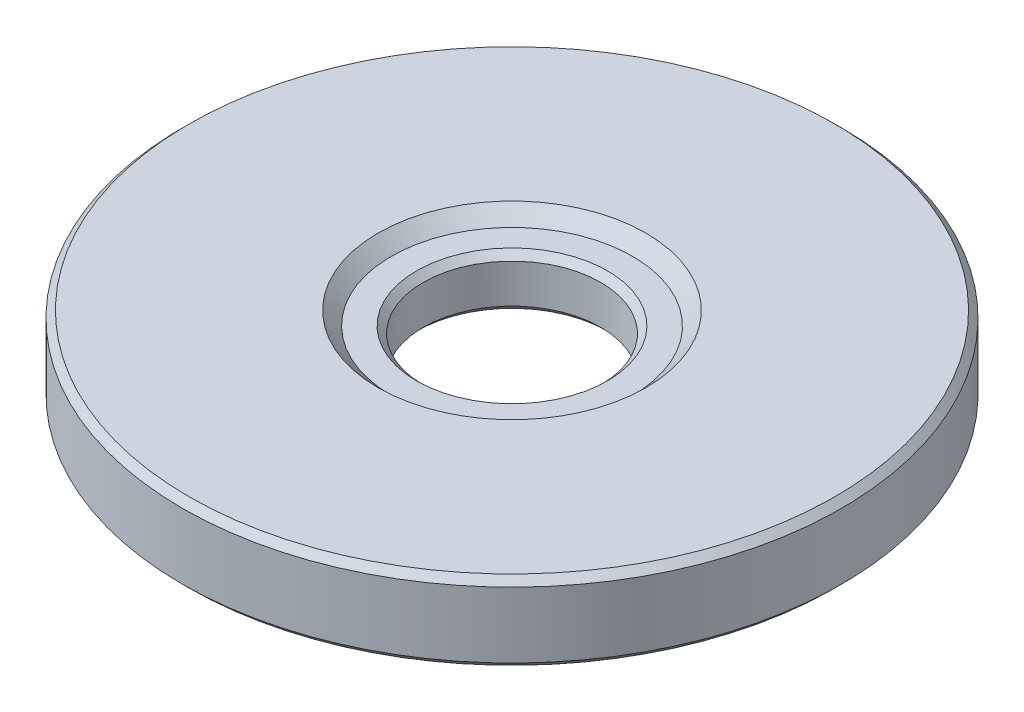
ISO-10303-21;
HEADER;
FILE_DESCRIPTION(('STEP AP214'),'2;1');
FILE_NAME('part.step','',(''),(''),'','','');
FILE_SCHEMA(('AUTOMOTIVE_DESIGN { 1 0 10303 214 1 1 1 1 }'));
ENDSEC;
DATA;
#1=APPLICATION_CONTEXT('core data for automotive mechanical design processes');
#2=APPLICATION_PROTOCOL_DEFINITION('international standard','automotive_design',2000,#1);
#3=PRODUCT_CONTEXT('',#1,'mechanical');
#4=PRODUCT('Part','Part','',(#3));
#5=PRODUCT_RELATED_PRODUCT_CATEGORY('part','',(#4));
#6=PRODUCT_DEFINITION_FORMATION('','',#4);
#7=PRODUCT_DEFINITION_CONTEXT('part definition',#1,'design');
#8=PRODUCT_DEFINITION('design','',#6,#7);
#9=PRODUCT_DEFINITION_SHAPE('','',#8);
#10=(LENGTH_UNIT() NAMED_UNIT(*) SI_UNIT(.MILLI.,.METRE.));
#11=(NAMED_UNIT(*) PLANE_ANGLE_UNIT() SI_UNIT($,.RADIAN.));
#12=(NAMED_UNIT(*) SI_UNIT($,.STERADIAN.) SOLID_ANGLE_UNIT());
#13=UNCERTAINTY_MEASURE_WITH_UNIT(LENGTH_MEASURE(1.E-05),#10,'distance_accuracy_value','');
#14=(GEOMETRIC_REPRESENTATION_CONTEXT(3) GLOBAL_UNCERTAINTY_ASSIGNED_CONTEXT((#13)) GLOBAL_UNIT_ASSIGNED_CONTEXT((#10,
#11,#12)) REPRESENTATION_CONTEXT('',''));
#15=CARTESIAN_POINT('',(0.,0.,0.));
#16=DIRECTION('',(0.,0.,1.));
#17=DIRECTION('',(1.,0.,0.));
#18=AXIS2_PLACEMENT_3D('',#15,#16,#17);
#19=CARTESIAN_POINT('',(43.4842650987548,27.1133773595333,-40.3474045988901));
#20=DIRECTION('',(0.,-1.,0.));
#21=DIRECTION('',(0.,0.,-1.));
#22=AXIS2_PLACEMENT_3D('',#19,#20,#21);
#23=CYLINDRICAL_SURFACE('',#22,12.5);
#24=CARTESIAN_POINT('',(43.4842650987548,24.3673773651333,-40.3474045988901));
#25=DIRECTION('',(0.,1.,0.));
#26=DIRECTION('',(0.,0.,1.));
#27=AXIS2_PLACEMENT_3D('',#24,#25,#26);
#28=CIRCLE('',#27,12.5);
#29=CARTESIAN_POINT('',(43.4842650987548,24.3673773651333,-27.8474045988901));
#30=VERTEX_POINT('',#29);
#31=EDGE_CURVE('E25',#30,#30,#28,.T.);
#32=ORIENTED_EDGE('',*,*,#31,.T.);
#33=EDGE_LOOP('',(#32));
#34=FACE_BOUND('',#33,.T.);
#35=CARTESIAN_POINT('',(43.4842650987548,26.8593773595333,-40.3474045988901));
#36=DIRECTION('',(0.,1.,0.));
#37=DIRECTION('',(0.,0.,1.));
#38=AXIS2_PLACEMENT_3D('',#35,#36,#37);
#39=CIRCLE('',#38,12.5);
#40=CARTESIAN_POINT('',(43.4842650987548,26.8593773595333,-27.8474045988901));
#41=VERTEX_POINT('',#40);
#42=EDGE_CURVE('E29',#41,#41,#39,.F.);
#43=ORIENTED_EDGE('',*,*,#42,.T.);
#44=EDGE_LOOP('',(#43));
#45=FACE_BOUND('',#44,.T.);
#46=ADVANCED_FACE('F14',(#34,#45),#23,.T.);
#47=CARTESIAN_POINT('',(43.4842650987548,27.1133773595333,-40.3474045988901));
#48=DIRECTION('',(0.,1.,0.));
#49=DIRECTION('',(0.,0.,1.));
#50=AXIS2_PLACEMENT_3D('',#47,#48,#49);
#51=PLANE('',#50);
#52=CARTESIAN_POINT('',(43.4842650987548,27.1133773595333,-40.3474045988901));
#53=DIRECTION('',(0.,1.,0.));
#54=DIRECTION('',(0.,0.,1.));
#55=AXIS2_PLACEMENT_3D('',#52,#53,#54);
#56=CIRCLE('',#55,12.246);
#57=CARTESIAN_POINT('',(43.4842650987548,27.1133773595333,-28.1014045988901));
#58=VERTEX_POINT('',#57);
#59=EDGE_CURVE('E9',#58,#58,#56,.T.);
#60=ORIENTED_EDGE('',*,*,#59,.T.);
#61=EDGE_LOOP('',(#60));
#62=FACE_BOUND('',#61,.T.);
#63=CARTESIAN_POINT('',(43.4842650987548,27.1133773595333,-40.3474045988901));
#64=DIRECTION('',(0.,1.,0.));
#65=DIRECTION('',(0.,0.,1.));
#66=AXIS2_PLACEMENT_3D('',#63,#64,#65);
#67=CIRCLE('',#66,5.08);
#68=CARTESIAN_POINT('',(43.4842650987548,27.1133773595333,-35.2674045988901));
#69=VERTEX_POINT('',#68);
#70=EDGE_CURVE('E55',#69,#69,#67,.T.);
#71=ORIENTED_EDGE('',*,*,#70,.F.);
#72=EDGE_LOOP('',(#71));
#73=FACE_BOUND('',#72,.T.);
#74=ADVANCED_FACE('F62',(#62,#73),#51,.T.);
#75=CARTESIAN_POINT('',(43.4842650987548,24.1133773651333,-40.3474045988901));
#76=DIRECTION('',(0.,1.,0.));
#77=DIRECTION('',(0.,0.,1.));
#78=AXIS2_PLACEMENT_3D('',#75,#76,#77);
#79=PLANE('',#78);
#80=CARTESIAN_POINT('',(43.4842650987548,24.1133773651333,-40.3474045988901));
#81=DIRECTION('',(0.,1.,0.));
#82=DIRECTION('',(0.,0.,1.));
#83=AXIS2_PLACEMENT_3D('',#80,#81,#82);
#84=CIRCLE('',#83,12.246);
#85=CARTESIAN_POINT('',(43.4842650987548,24.1133773651333,-28.1014045988901));
#86=VERTEX_POINT('',#85);
#87=EDGE_CURVE('E21',#86,#86,#84,.F.);
#88=ORIENTED_EDGE('',*,*,#87,.T.);
#89=EDGE_LOOP('',(#88));
#90=FACE_BOUND('',#89,.T.);
#91=CARTESIAN_POINT('',(43.4842650987548,24.1133773651333,-40.3474045988901));
#92=DIRECTION('',(0.,-1.,0.));
#93=DIRECTION('',(0.,0.,-1.));
#94=AXIS2_PLACEMENT_3D('',#91,#92,#93);
#95=CIRCLE('',#94,5.08);
#96=CARTESIAN_POINT('',(43.4842650987548,24.1133773651333,-45.4274045988901));
#97=VERTEX_POINT('',#96);
#98=EDGE_CURVE('E52',#97,#97,#95,.T.);
#99=ORIENTED_EDGE('',*,*,#98,.F.);
#100=EDGE_LOOP('',(#99));
#101=FACE_BOUND('',#100,.T.);
#102=ADVANCED_FACE('F64',(#90,#101),#79,.F.);
#103=CARTESIAN_POINT('',(43.4842650987548,24.6213773651333,-40.3474045988901));
#104=DIRECTION('',(0.,-1.,0.));
#105=DIRECTION('',(0.,0.,-1.));
#106=AXIS2_PLACEMENT_3D('',#103,#104,#105);
#107=PLANE('',#106);
#108=CARTESIAN_POINT('',(43.4842650987548,24.6213773651333,-40.3474045988901));
#109=DIRECTION('',(0.,-1.,0.));
#110=DIRECTION('',(0.,0.,-1.));
#111=AXIS2_PLACEMENT_3D('',#108,#109,#110);
#112=CIRCLE('',#111,3.61949999999999);
#113=CARTESIAN_POINT('',(43.4842650987548,24.6213773651333,-43.9669045988901));
#114=VERTEX_POINT('',#113);
#115=EDGE_CURVE('E34',#114,#114,#112,.F.);
#116=ORIENTED_EDGE('',*,*,#115,.T.);
#117=EDGE_LOOP('',(#116));
#118=FACE_BOUND('',#117,.T.);
#119=CARTESIAN_POINT('',(43.4842650987548,24.6213773651333,-40.3474045988901));
#120=DIRECTION('',(0.,-1.,0.));
#121=DIRECTION('',(0.,0.,-1.));
#122=AXIS2_PLACEMENT_3D('',#119,#120,#121);
#123=CIRCLE('',#122,4.572);
#124=CARTESIAN_POINT('',(43.4842650987548,24.6213773651333,-44.9194045988901));
#125=VERTEX_POINT('',#124);
#126=EDGE_CURVE('E46',#125,#125,#123,.T.);
#127=ORIENTED_EDGE('',*,*,#126,.T.);
#128=EDGE_LOOP('',(#127));
#129=FACE_BOUND('',#128,.T.);
#130=ADVANCED_FACE('F71',(#118,#129),#107,.T.);
#131=CARTESIAN_POINT('',(43.4842650987548,26.6053773595333,-40.3474045988901));
#132=DIRECTION('',(0.,1.,0.));
#133=DIRECTION('',(0.,0.,1.));
#134=AXIS2_PLACEMENT_3D('',#131,#132,#133);
#135=PLANE('',#134);
#136=CARTESIAN_POINT('',(43.4842650987548,26.6053773595333,-40.3474045988901));
#137=DIRECTION('',(0.,1.,0.));
#138=DIRECTION('',(0.,0.,1.));
#139=AXIS2_PLACEMENT_3D('',#136,#137,#138);
#140=CIRCLE('',#139,3.6195);
#141=CARTESIAN_POINT('',(43.4842650987548,26.6053773595333,-36.7279045988901));
#142=VERTEX_POINT('',#141);
#143=EDGE_CURVE('E37',#142,#142,#140,.F.);
#144=ORIENTED_EDGE('',*,*,#143,.T.);
#145=EDGE_LOOP('',(#144));
#146=FACE_BOUND('',#145,.T.);
#147=CARTESIAN_POINT('',(43.4842650987548,26.6053773595333,-40.3474045988901));
#148=DIRECTION('',(0.,1.,0.));
#149=DIRECTION('',(0.,0.,1.));
#150=AXIS2_PLACEMENT_3D('',#147,#148,#149);
#151=CIRCLE('',#150,4.572);
#152=CARTESIAN_POINT('',(43.4842650987548,26.6053773595333,-35.7754045988901));
#153=VERTEX_POINT('',#152);
#154=EDGE_CURVE('E49',#153,#153,#151,.T.);
#155=ORIENTED_EDGE('',*,*,#154,.T.);
#156=EDGE_LOOP('',(#155));
#157=FACE_BOUND('',#156,.T.);
#158=ADVANCED_FACE('F81',(#146,#157),#135,.T.);
#159=CARTESIAN_POINT('',(43.4842650987548,26.6053773595333,-40.3474045988901));
#160=DIRECTION('',(0.,1.,0.));
#161=DIRECTION('',(0.,0.,1.));
#162=AXIS2_PLACEMENT_3D('',#159,#160,#161);
#163=CONICAL_SURFACE('',#162,4.572,0.785398163397448);
#164=CARTESIAN_POINT('',(43.4842650987548,27.1133773595333,-35.2674045988901));
#165=CARTESIAN_POINT('',(43.4842650987548,27.1080856928666,-35.2726962655567));
#166=CARTESIAN_POINT('',(43.4842650987548,27.1027940261999,-35.2779879322234));
#167=CARTESIAN_POINT('',(43.4842650987548,27.0922106928666,-35.2885712655568));
#168=CARTESIAN_POINT('',(43.4842650987548,27.0869190261999,-35.2938629322234));
#169=CARTESIAN_POINT('',(43.4842650987548,27.0763356928666,-35.3044462655568));
#170=CARTESIAN_POINT('',(43.4842650987548,27.0710440261999,-35.3097379322234));
#171=CARTESIAN_POINT('',(43.4842650987548,27.0604606928666,-35.3203212655567));
#172=CARTESIAN_POINT('',(43.4842650987548,27.0551690261999,-35.3256129322234));
#173=CARTESIAN_POINT('',(43.4842650987548,27.0445856928666,-35.3361962655568));
#174=CARTESIAN_POINT('',(43.4842650987548,27.0392940261999,-35.3414879322234));
#175=CARTESIAN_POINT('',(43.4842650987548,27.0287106928666,-35.3520712655568));
#176=CARTESIAN_POINT('',(43.4842650987548,27.0234190261999,-35.3573629322234));
#177=CARTESIAN_POINT('',(43.4842650987548,27.0128356928666,-35.3679462655568));
#178=CARTESIAN_POINT('',(43.4842650987548,27.0075440261999,-35.3732379322234));
#179=CARTESIAN_POINT('',(43.4842650987548,26.9969606928666,-35.3838212655568));
#180=CARTESIAN_POINT('',(43.4842650987548,26.9916690261999,-35.3891129322234));
#181=CARTESIAN_POINT('',(43.4842650987548,26.9810856928666,-35.3996962655567));
#182=CARTESIAN_POINT('',(43.4842650987548,26.9757940261999,-35.4049879322234));
#183=CARTESIAN_POINT('',(43.4842650987548,26.9652106928666,-35.4155712655567));
#184=CARTESIAN_POINT('',(43.4842650987548,26.9599190261999,-35.4208629322234));
#185=CARTESIAN_POINT('',(43.4842650987548,26.9493356928666,-35.4314462655568));
#186=CARTESIAN_POINT('',(43.4842650987548,26.9440440261999,-35.4367379322234));
#187=CARTESIAN_POINT('',(43.4842650987548,26.9334606928666,-35.4473212655568));
#188=CARTESIAN_POINT('',(43.4842650987548,26.9281690261999,-35.4526129322234));
#189=CARTESIAN_POINT('',(43.4842650987548,26.9175856928666,-35.4631962655568));
#190=CARTESIAN_POINT('',(43.4842650987548,26.9122940261999,-35.4684879322234));
#191=CARTESIAN_POINT('',(43.4842650987548,26.9017106928666,-35.4790712655568));
#192=CARTESIAN_POINT('',(43.4842650987548,26.8964190261999,-35.4843629322234));
#193=CARTESIAN_POINT('',(43.4842650987548,26.8858356928666,-35.4949462655567));
#194=CARTESIAN_POINT('',(43.4842650987548,26.8805440261999,-35.5002379322234));
#195=CARTESIAN_POINT('',(43.4842650987548,26.8699606928666,-35.5108212655567));
#196=CARTESIAN_POINT('',(43.4842650987548,26.8646690261999,-35.5161129322234));
#197=CARTESIAN_POINT('',(43.4842650987548,26.8540856928666,-35.5266962655568));
#198=CARTESIAN_POINT('',(43.4842650987548,26.8487940261999,-35.5319879322234));
#199=CARTESIAN_POINT('',(43.4842650987548,26.8382106928666,-35.5425712655568));
#200=CARTESIAN_POINT('',(43.4842650987548,26.8329190261999,-35.5478629322234));
#201=CARTESIAN_POINT('',(43.4842650987548,26.8223356928666,-35.5584462655568));
#202=CARTESIAN_POINT('',(43.4842650987548,26.8170440261999,-35.5637379322234));
#203=CARTESIAN_POINT('',(43.4842650987548,26.8064606928666,-35.5743212655567));
#204=CARTESIAN_POINT('',(43.4842650987548,26.8011690261999,-35.5796129322234));
#205=CARTESIAN_POINT('',(43.4842650987548,26.7905856928666,-35.5901962655568));
#206=CARTESIAN_POINT('',(43.4842650987548,26.7852940261999,-35.5954879322234));
#207=CARTESIAN_POINT('',(43.4842650987548,26.7747106928666,-35.6060712655567));
#208=CARTESIAN_POINT('',(43.4842650987548,26.7694190261999,-35.6113629322234));
#209=CARTESIAN_POINT('',(43.4842650987548,26.7588356928666,-35.6219462655568));
#210=CARTESIAN_POINT('',(43.4842650987548,26.7535440261999,-35.6272379322234));
#211=CARTESIAN_POINT('',(43.4842650987548,26.7429606928666,-35.6378212655568));
#212=CARTESIAN_POINT('',(43.4842650987548,26.7376690261999,-35.6431129322234));
#213=CARTESIAN_POINT('',(43.4842650987548,26.7270856928666,-35.6536962655567));
#214=CARTESIAN_POINT('',(43.4842650987548,26.7217940261999,-35.6589879322234));
#215=CARTESIAN_POINT('',(43.4842650987548,26.7112106928666,-35.6695712655567));
#216=CARTESIAN_POINT('',(43.4842650987548,26.7059190261999,-35.6748629322234));
#217=CARTESIAN_POINT('',(43.4842650987548,26.6953356928666,-35.6854462655568));
#218=CARTESIAN_POINT('',(43.4842650987548,26.6900440261999,-35.6907379322234));
#219=CARTESIAN_POINT('',(43.4842650987548,26.6794606928666,-35.7013212655568));
#220=CARTESIAN_POINT('',(43.4842650987548,26.6741690261999,-35.7066129322234));
#221=CARTESIAN_POINT('',(43.4842650987548,26.6635856928666,-35.7171962655568));
#222=CARTESIAN_POINT('',(43.4842650987548,26.6582940261999,-35.7224879322234));
#223=CARTESIAN_POINT('',(43.4842650987548,26.6477106928666,-35.7330712655567));
#224=CARTESIAN_POINT('',(43.4842650987548,26.6424190261999,-35.7383629322234));
#225=CARTESIAN_POINT('',(43.4842650987548,26.6318356928666,-35.7489462655568));
#226=CARTESIAN_POINT('',(43.4842650987548,26.6265440261999,-35.7542379322234));
#227=CARTESIAN_POINT('',(43.4842650987548,26.6159606928666,-35.7648212655568));
#228=CARTESIAN_POINT('',(43.4842650987548,26.6106690261999,-35.7701129322234));
#229=CARTESIAN_POINT('',(43.4842650987548,26.6053773595333,-35.7754045988901));
#230=B_SPLINE_CURVE_WITH_KNOTS('',3,(#164,#165,#166,#167,#168,#169,#170,#171,#172,#173,#174,
#175,#176,#177,#178,#179,#180,#181,#182,#183,#184,#185,#186,#187,#188,#189,#190,#191,#192,#193,
#194,#195,#196,#197,#198,#199,#200,#201,#202,#203,#204,#205,#206,#207,#208,#209,#210,#211,#212,
#213,#214,#215,#216,#217,#218,#219,#220,#221,#222,#223,#224,#225,#226,#227,#228,#229),
.UNSPECIFIED.,.F.,.F.,(4,2,2,2,2,2,2,2,2,2,2,2,2,2,2,2,2,2,2,2,2,2,2,2,2,2,2,2,2,2,2,2,4),(0.,
0.0224506403026733,0.044901280605349,0.0673519209080222,0.089802561210693,0.112253201513364,
0.134703841816037,0.157154482118713,0.179605122421386,0.202055762724057,0.22450640302673,
0.246957043329406,0.269407683632077,0.29185832393475,0.314308964237421,0.336759604540094,
0.359210244842765,0.38166088514544,0.404111525448114,0.426562165750784,0.449012806053458,
0.471463446356133,0.493914086658804,0.516364726961478,0.538815367264148,0.561266007566822,
0.583716647869492,0.606167288172168,0.628617928474841,0.651068568777512,0.673519209080185,
0.695969849382861,0.718420489685532),.UNSPECIFIED.);
#231=EDGE_CURVE('BSEAM59',#69,#153,#230,.T.);
#232=ORIENTED_EDGE('',*,*,#70,.T.);
#233=ORIENTED_EDGE('',*,*,#154,.F.);
#234=ORIENTED_EDGE('',*,*,#231,.T.);
#235=ORIENTED_EDGE('',*,*,#231,.F.);
#236=EDGE_LOOP('',(#232,#234,#233,#235));
#237=FACE_BOUND('',#236,.T.);
#238=ADVANCED_FACE('F59',(#237),#163,.F.);
#239=CARTESIAN_POINT('',(43.4842650987548,24.6213773651333,-40.3474045988901));
#240=DIRECTION('',(0.,-1.,0.));
#241=DIRECTION('',(0.,0.,-1.));
#242=AXIS2_PLACEMENT_3D('',#239,#240,#241);
#243=CONICAL_SURFACE('',#242,4.572,0.785398163397446);
#244=ORIENTED_EDGE('',*,*,#98,.T.);
#245=EDGE_LOOP('',(#244));
#246=FACE_BOUND('',#245,.T.);
#247=ORIENTED_EDGE('',*,*,#126,.F.);
#248=EDGE_LOOP('',(#247));
#249=FACE_BOUND('',#248,.T.);
#250=ADVANCED_FACE('F80',(#246,#249),#243,.F.);
#251=CARTESIAN_POINT('',(43.4842650987548,27.1133773595333,-40.3474045988901));
#252=DIRECTION('',(0.,-1.,0.));
#253=DIRECTION('',(0.,0.,-1.));
#254=AXIS2_PLACEMENT_3D('',#251,#252,#253);
#255=CYLINDRICAL_SURFACE('',#254,3.3655);
#256=CARTESIAN_POINT('',(43.4842650987548,26.3513773595333,-40.3474045988901));
#257=DIRECTION('',(0.,1.,0.));
#258=DIRECTION('',(0.,0.,1.));
#259=AXIS2_PLACEMENT_3D('',#256,#257,#258);
#260=CIRCLE('',#259,3.3655);
#261=CARTESIAN_POINT('',(43.4842650987548,26.3513773595333,-36.9819045988901));
#262=VERTEX_POINT('',#261);
#263=EDGE_CURVE('E40',#262,#262,#260,.T.);
#264=ORIENTED_EDGE('',*,*,#263,.T.);
#265=EDGE_LOOP('',(#264));
#266=FACE_BOUND('',#265,.T.);
#267=CARTESIAN_POINT('',(43.4842650987548,24.8753773651333,-40.3474045988901));
#268=DIRECTION('',(0.,-1.,0.));
#269=DIRECTION('',(0.,0.,-1.));
#270=AXIS2_PLACEMENT_3D('',#267,#268,#269);
#271=CIRCLE('',#270,3.3655);
#272=CARTESIAN_POINT('',(43.4842650987548,24.8753773651333,-43.7129045988901));
#273=VERTEX_POINT('',#272);
#274=EDGE_CURVE('E43',#273,#273,#271,.T.);
#275=ORIENTED_EDGE('',*,*,#274,.T.);
#276=EDGE_LOOP('',(#275));
#277=FACE_BOUND('',#276,.T.);
#278=ADVANCED_FACE('F84',(#266,#277),#255,.F.);
#279=CARTESIAN_POINT('',(43.4842650987548,26.3513773595333,-40.3474045988901));
#280=DIRECTION('',(0.,1.,0.));
#281=DIRECTION('',(0.,0.,1.));
#282=AXIS2_PLACEMENT_3D('',#279,#280,#281);
#283=CONICAL_SURFACE('',#282,3.3655,0.785398163397448);
#284=ORIENTED_EDGE('',*,*,#143,.F.);
#285=EDGE_LOOP('',(#284));
#286=FACE_BOUND('',#285,.T.);
#287=ORIENTED_EDGE('',*,*,#263,.F.);
#288=EDGE_LOOP('',(#287));
#289=FACE_BOUND('',#288,.T.);
#290=ADVANCED_FACE('F86',(#286,#289),#283,.F.);
#291=CARTESIAN_POINT('',(43.4842650987548,24.8753773651333,-40.3474045988901));
#292=DIRECTION('',(0.,-1.,0.));
#293=DIRECTION('',(0.,0.,-1.));
#294=AXIS2_PLACEMENT_3D('',#291,#292,#293);
#295=CONICAL_SURFACE('',#294,3.3655,0.785398163397449);
#296=ORIENTED_EDGE('',*,*,#115,.F.);
#297=EDGE_LOOP('',(#296));
#298=FACE_BOUND('',#297,.T.);
#299=ORIENTED_EDGE('',*,*,#274,.F.);
#300=EDGE_LOOP('',(#299));
#301=FACE_BOUND('',#300,.T.);
#302=ADVANCED_FACE('F89',(#298,#301),#295,.F.);
#303=CARTESIAN_POINT('',(43.4842650987548,24.3673773651333,-40.3474045988901));
#304=DIRECTION('',(0.,1.,0.));
#305=DIRECTION('',(0.,0.,1.));
#306=AXIS2_PLACEMENT_3D('',#303,#304,#305);
#307=CONICAL_SURFACE('',#306,12.5,0.785398163397452);
#308=ORIENTED_EDGE('',*,*,#87,.F.);
#309=EDGE_LOOP('',(#308));
#310=FACE_BOUND('',#309,.T.);
#311=ORIENTED_EDGE('',*,*,#31,.F.);
#312=EDGE_LOOP('',(#311));
#313=FACE_BOUND('',#312,.T.);
#314=ADVANCED_FACE('F92',(#310,#313),#307,.T.);
#315=CARTESIAN_POINT('',(43.4842650987548,27.1133773595333,-40.3474045988901));
#316=DIRECTION('',(0.,-1.,0.));
#317=DIRECTION('',(0.,0.,-1.));
#318=AXIS2_PLACEMENT_3D('',#315,#316,#317);
#319=CONICAL_SURFACE('',#318,12.246,0.785398163397448);
#320=ORIENTED_EDGE('',*,*,#42,.F.);
#321=EDGE_LOOP('',(#320));
#322=FACE_BOUND('',#321,.T.);
#323=ORIENTED_EDGE('',*,*,#59,.F.);
#324=EDGE_LOOP('',(#323));
#325=FACE_BOUND('',#324,.T.);
#326=ADVANCED_FACE('F16',(#322,#325),#319,.T.);
#327=CLOSED_SHELL('',(#46,#74,#102,#130,#158,#238,#250,#278,#290,#302,#314,#326));
#328=MANIFOLD_SOLID_BREP('B1',#327);
#329=ADVANCED_BREP_SHAPE_REPRESENTATION('',(#18,#328),#14);
#330=SHAPE_DEFINITION_REPRESENTATION(#9,#329);
ENDSEC;
END-ISO-10303-21;
